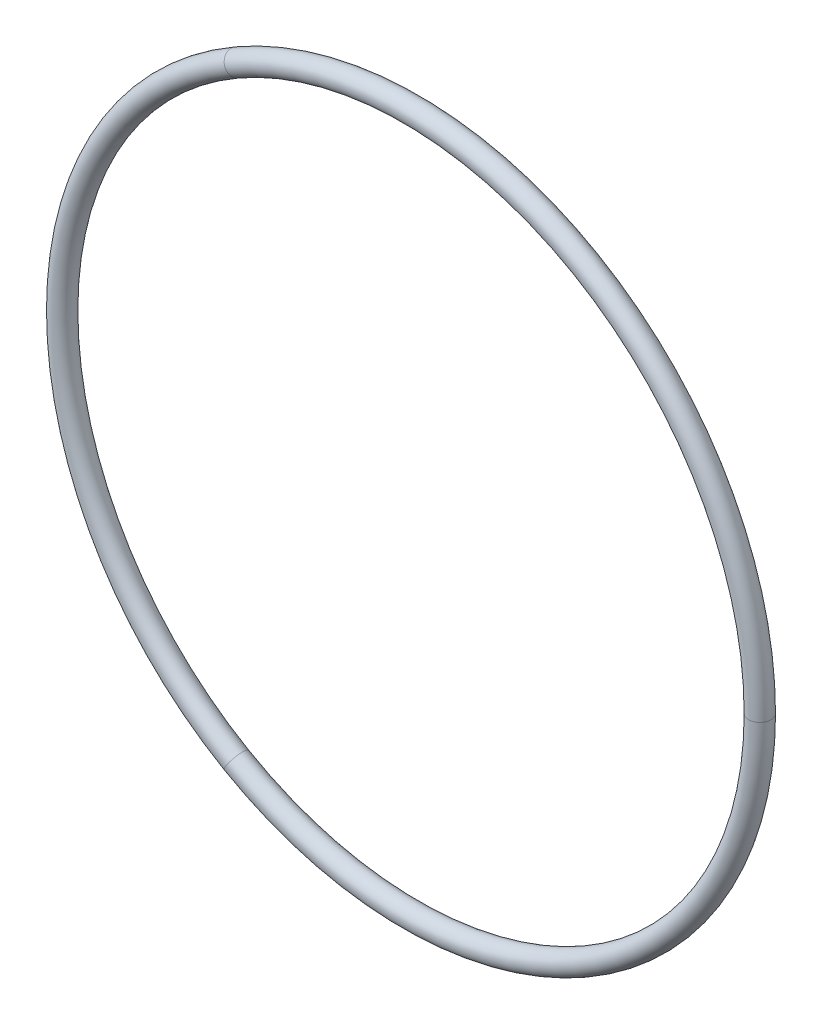
ISO-10303-21;
HEADER;
FILE_DESCRIPTION(('STEP AP214'),'2;1');
FILE_NAME('part.step','',(''),(''),'','','');
FILE_SCHEMA(('AUTOMOTIVE_DESIGN { 1 0 10303 214 1 1 1 1 }'));
ENDSEC;
DATA;
#1=APPLICATION_CONTEXT('core data for automotive mechanical design processes');
#2=APPLICATION_PROTOCOL_DEFINITION('international standard','automotive_design',2000,#1);
#3=PRODUCT_CONTEXT('',#1,'mechanical');
#4=PRODUCT('Part','Part','',(#3));
#5=PRODUCT_RELATED_PRODUCT_CATEGORY('part','',(#4));
#6=PRODUCT_DEFINITION_FORMATION('','',#4);
#7=PRODUCT_DEFINITION_CONTEXT('part definition',#1,'design');
#8=PRODUCT_DEFINITION('design','',#6,#7);
#9=PRODUCT_DEFINITION_SHAPE('','',#8);
#10=(LENGTH_UNIT() NAMED_UNIT(*) SI_UNIT(.MILLI.,.METRE.));
#11=(NAMED_UNIT(*) PLANE_ANGLE_UNIT() SI_UNIT($,.RADIAN.));
#12=(NAMED_UNIT(*) SI_UNIT($,.STERADIAN.) SOLID_ANGLE_UNIT());
#13=UNCERTAINTY_MEASURE_WITH_UNIT(LENGTH_MEASURE(1.E-05),#10,'distance_accuracy_value','');
#14=(GEOMETRIC_REPRESENTATION_CONTEXT(3) GLOBAL_UNCERTAINTY_ASSIGNED_CONTEXT((#13)) GLOBAL_UNIT_ASSIGNED_CONTEXT((#10,
#11,#12)) REPRESENTATION_CONTEXT('',''));
#15=CARTESIAN_POINT('',(0.,0.,0.));
#16=DIRECTION('',(0.,0.,1.));
#17=DIRECTION('',(1.,0.,0.));
#18=AXIS2_PLACEMENT_3D('',#15,#16,#17);
#19=CARTESIAN_POINT('',(0.,0.,1.));
#20=DIRECTION('',(0.,0.,-1.));
#21=DIRECTION('',(-1.,0.,0.));
#22=AXIS2_PLACEMENT_3D('',#19,#20,#21);
#23=TOROIDAL_SURFACE('',#22,31.45,1.);
#24=CARTESIAN_POINT('',(-15.725,27.2364989490206,1.));
#25=DIRECTION('',(-0.866025403784444,-0.499999999999991,0.));
#26=DIRECTION('',(0.499999999999991,-0.866025403784444,0.));
#27=AXIS2_PLACEMENT_3D('',#24,#25,#26);
#28=CIRCLE('',#27,1.);
#29=CARTESIAN_POINT('',(-16.225,28.102524352805,1.));
#30=VERTEX_POINT('',#29);
#31=EDGE_CURVE('E60',#30,#30,#28,.T.);
#32=CARTESIAN_POINT('',(31.45,0.,1.));
#33=DIRECTION('',(0.,1.,0.));
#34=DIRECTION('',(-1.,0.,0.));
#35=AXIS2_PLACEMENT_3D('',#32,#33,#34);
#36=CIRCLE('',#35,1.);
#37=CARTESIAN_POINT('',(32.45,0.,1.));
#38=VERTEX_POINT('',#37);
#39=EDGE_CURVE('E56',#38,#38,#36,.T.);
#40=CARTESIAN_POINT('',(0.,0.,1.));
#41=DIRECTION('',(0.,0.,-1.));
#42=DIRECTION('',(-1.,0.,0.));
#43=AXIS2_PLACEMENT_3D('',#40,#41,#42);
#44=CIRCLE('',#43,32.45);
#45=EDGE_CURVE('',#30,#38,#44,.T.);
#46=ORIENTED_EDGE('',*,*,#31,.F.);
#47=ORIENTED_EDGE('',*,*,#39,.T.);
#48=ORIENTED_EDGE('',*,*,#45,.T.);
#49=ORIENTED_EDGE('',*,*,#45,.F.);
#50=EDGE_LOOP('',(#46,#48,#47,#49));
#51=FACE_BOUND('',#50,.T.);
#52=ADVANCED_FACE('F49',(#51),#23,.T.);
#53=CARTESIAN_POINT('',(0.,0.,1.));
#54=DIRECTION('',(0.,0.,-1.));
#55=DIRECTION('',(-1.,0.,0.));
#56=AXIS2_PLACEMENT_3D('',#53,#54,#55);
#57=TOROIDAL_SURFACE('',#56,31.45,1.);
#58=CARTESIAN_POINT('',(-15.725,-27.2364989490206,1.));
#59=DIRECTION('',(0.866025403784433,-0.50000000000001,0.));
#60=DIRECTION('',(0.50000000000001,0.866025403784433,0.));
#61=AXIS2_PLACEMENT_3D('',#58,#59,#60);
#62=CIRCLE('',#61,1.);
#63=CARTESIAN_POINT('',(-16.225,-28.102524352805,1.));
#64=VERTEX_POINT('',#63);
#65=EDGE_CURVE('E11',#64,#64,#62,.T.);
#66=CARTESIAN_POINT('',(0.,0.,1.));
#67=DIRECTION('',(0.,0.,-1.));
#68=DIRECTION('',(-1.,0.,0.));
#69=AXIS2_PLACEMENT_3D('',#66,#67,#68);
#70=CIRCLE('',#69,32.45);
#71=EDGE_CURVE('',#38,#64,#70,.T.);
#72=ORIENTED_EDGE('',*,*,#39,.F.);
#73=ORIENTED_EDGE('',*,*,#65,.T.);
#74=ORIENTED_EDGE('',*,*,#71,.T.);
#75=ORIENTED_EDGE('',*,*,#71,.F.);
#76=EDGE_LOOP('',(#72,#74,#73,#75));
#77=FACE_BOUND('',#76,.T.);
#78=ADVANCED_FACE('F70',(#77),#57,.T.);
#79=CARTESIAN_POINT('',(0.,0.,1.));
#80=DIRECTION('',(0.,0.,-1.));
#81=DIRECTION('',(-1.,0.,0.));
#82=AXIS2_PLACEMENT_3D('',#79,#80,#81);
#83=TOROIDAL_SURFACE('',#82,31.45,1.);
#84=CARTESIAN_POINT('',(0.,0.,1.));
#85=DIRECTION('',(0.,0.,-1.));
#86=DIRECTION('',(-1.,0.,0.));
#87=AXIS2_PLACEMENT_3D('',#84,#85,#86);
#88=CIRCLE('',#87,32.45);
#89=EDGE_CURVE('',#64,#30,#88,.T.);
#90=ORIENTED_EDGE('',*,*,#65,.F.);
#91=ORIENTED_EDGE('',*,*,#31,.T.);
#92=ORIENTED_EDGE('',*,*,#89,.T.);
#93=ORIENTED_EDGE('',*,*,#89,.F.);
#94=EDGE_LOOP('',(#90,#92,#91,#93));
#95=FACE_BOUND('',#94,.T.);
#96=ADVANCED_FACE('F51',(#95),#83,.T.);
#97=CLOSED_SHELL('',(#52,#78,#96));
#98=MANIFOLD_SOLID_BREP('B2',#97);
#99=ADVANCED_BREP_SHAPE_REPRESENTATION('',(#18,#98),#14);
#100=SHAPE_DEFINITION_REPRESENTATION(#9,#99);
ENDSEC;
END-ISO-10303-21;
